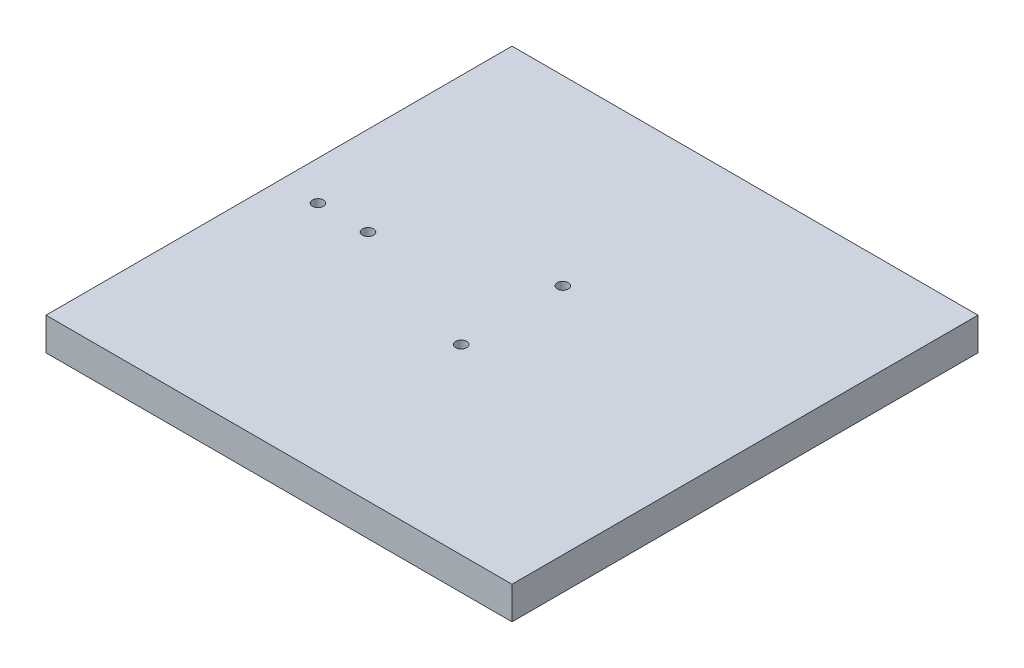
ISO-10303-21;
HEADER;
FILE_DESCRIPTION(('STEP AP214'),'2;1');
FILE_NAME('part.step','',(''),(''),'','','');
FILE_SCHEMA(('AUTOMOTIVE_DESIGN { 1 0 10303 214 1 1 1 1 }'));
ENDSEC;
DATA;
#1=APPLICATION_CONTEXT('core data for automotive mechanical design processes');
#2=APPLICATION_PROTOCOL_DEFINITION('international standard','automotive_design',2000,#1);
#3=PRODUCT_CONTEXT('',#1,'mechanical');
#4=PRODUCT('Part','Part','',(#3));
#5=PRODUCT_RELATED_PRODUCT_CATEGORY('part','',(#4));
#6=PRODUCT_DEFINITION_FORMATION('','',#4);
#7=PRODUCT_DEFINITION_CONTEXT('part definition',#1,'design');
#8=PRODUCT_DEFINITION('design','',#6,#7);
#9=PRODUCT_DEFINITION_SHAPE('','',#8);
#10=(LENGTH_UNIT() NAMED_UNIT(*) SI_UNIT(.MILLI.,.METRE.));
#11=(NAMED_UNIT(*) PLANE_ANGLE_UNIT() SI_UNIT($,.RADIAN.));
#12=(NAMED_UNIT(*) SI_UNIT($,.STERADIAN.) SOLID_ANGLE_UNIT());
#13=UNCERTAINTY_MEASURE_WITH_UNIT(LENGTH_MEASURE(1.E-05),#10,'distance_accuracy_value','');
#14=(GEOMETRIC_REPRESENTATION_CONTEXT(3) GLOBAL_UNCERTAINTY_ASSIGNED_CONTEXT((#13)) GLOBAL_UNIT_ASSIGNED_CONTEXT((#10,
#11,#12)) REPRESENTATION_CONTEXT('',''));
#15=CARTESIAN_POINT('',(0.,0.,0.));
#16=DIRECTION('',(0.,0.,1.));
#17=DIRECTION('',(1.,0.,0.));
#18=AXIS2_PLACEMENT_3D('',#15,#16,#17);
#19=CARTESIAN_POINT('',(0.,0.,139.7));
#20=DIRECTION('',(1.,0.,0.));
#21=DIRECTION('',(0.,0.,-1.));
#22=AXIS2_PLACEMENT_3D('',#19,#20,#21);
#23=PLANE('',#22);
#24=DIRECTION('',(0.,-1.,0.));
#25=VECTOR('',#24,1.);
#26=CARTESIAN_POINT('',(0.,0.,0.));
#27=LINE('',#26,#25);
#28=CARTESIAN_POINT('',(0.,9.779,0.));
#29=VERTEX_POINT('',#28);
#30=CARTESIAN_POINT('',(0.,0.,0.));
#31=VERTEX_POINT('',#30);
#32=EDGE_CURVE('E110',#29,#31,#27,.T.);
#33=ORIENTED_EDGE('',*,*,#32,.T.);
#34=DIRECTION('',(0.,0.,-1.));
#35=VECTOR('',#34,1.);
#36=CARTESIAN_POINT('',(0.,0.,139.7));
#37=LINE('',#36,#35);
#38=CARTESIAN_POINT('',(0.,0.,139.7));
#39=VERTEX_POINT('',#38);
#40=EDGE_CURVE('E12',#39,#31,#37,.T.);
#41=ORIENTED_EDGE('',*,*,#40,.F.);
#42=DIRECTION('',(0.,-1.,0.));
#43=VECTOR('',#42,1.);
#44=CARTESIAN_POINT('',(0.,0.,139.7));
#45=LINE('',#44,#43);
#46=CARTESIAN_POINT('',(0.,9.779,139.7));
#47=VERTEX_POINT('',#46);
#48=EDGE_CURVE('E98',#47,#39,#45,.T.);
#49=ORIENTED_EDGE('',*,*,#48,.F.);
#50=DIRECTION('',(0.,0.,-1.));
#51=VECTOR('',#50,1.);
#52=CARTESIAN_POINT('',(0.,9.779,139.7));
#53=LINE('',#52,#51);
#54=EDGE_CURVE('E106',#47,#29,#53,.T.);
#55=ORIENTED_EDGE('',*,*,#54,.T.);
#56=EDGE_LOOP('',(#33,#41,#49,#55));
#57=FACE_BOUND('',#56,.T.);
#58=ADVANCED_FACE('F47',(#57),#23,.F.);
#59=CARTESIAN_POINT('',(0.,0.,139.7));
#60=DIRECTION('',(0.,1.,0.));
#61=DIRECTION('',(0.,0.,1.));
#62=AXIS2_PLACEMENT_3D('',#59,#60,#61);
#63=PLANE('',#62);
#64=CARTESIAN_POINT('',(69.85,0.,54.61));
#65=DIRECTION('',(0.,1.,0.));
#66=DIRECTION('',(0.,0.,1.));
#67=AXIS2_PLACEMENT_3D('',#64,#65,#66);
#68=CIRCLE('',#67,1.65);
#69=CARTESIAN_POINT('',(69.85,0.,56.26));
#70=VERTEX_POINT('',#69);
#71=EDGE_CURVE('E128',#70,#70,#68,.T.);
#72=ORIENTED_EDGE('',*,*,#71,.T.);
#73=EDGE_LOOP('',(#72));
#74=FACE_BOUND('',#73,.T.);
#75=CARTESIAN_POINT('',(69.85,0.,85.09));
#76=DIRECTION('',(0.,1.,0.));
#77=DIRECTION('',(0.,0.,1.));
#78=AXIS2_PLACEMENT_3D('',#75,#76,#77);
#79=CIRCLE('',#78,1.65);
#80=CARTESIAN_POINT('',(69.85,0.,86.74));
#81=VERTEX_POINT('',#80);
#82=EDGE_CURVE('E139',#81,#81,#79,.T.);
#83=ORIENTED_EDGE('',*,*,#82,.T.);
#84=EDGE_LOOP('',(#83));
#85=FACE_BOUND('',#84,.T.);
#86=CARTESIAN_POINT('',(26.684,0.,69.85));
#87=DIRECTION('',(0.,1.,0.));
#88=DIRECTION('',(0.,0.,1.));
#89=AXIS2_PLACEMENT_3D('',#86,#87,#88);
#90=CIRCLE('',#89,1.65);
#91=CARTESIAN_POINT('',(26.684,0.,71.5));
#92=VERTEX_POINT('',#91);
#93=EDGE_CURVE('E113',#92,#92,#90,.T.);
#94=ORIENTED_EDGE('',*,*,#93,.T.);
#95=EDGE_LOOP('',(#94));
#96=FACE_BOUND('',#95,.T.);
#97=CARTESIAN_POINT('',(11.684,0.,69.85));
#98=DIRECTION('',(0.,1.,0.));
#99=DIRECTION('',(0.,0.,1.));
#100=AXIS2_PLACEMENT_3D('',#97,#98,#99);
#101=CIRCLE('',#100,1.65);
#102=CARTESIAN_POINT('',(11.684,0.,71.5));
#103=VERTEX_POINT('',#102);
#104=EDGE_CURVE('E124',#103,#103,#101,.T.);
#105=ORIENTED_EDGE('',*,*,#104,.T.);
#106=EDGE_LOOP('',(#105));
#107=FACE_BOUND('',#106,.T.);
#108=DIRECTION('',(1.,0.,0.));
#109=VECTOR('',#108,1.);
#110=CARTESIAN_POINT('',(0.,0.,0.));
#111=LINE('',#110,#109);
#112=CARTESIAN_POINT('',(139.7,0.,0.));
#113=VERTEX_POINT('',#112);
#114=EDGE_CURVE('E102',#31,#113,#111,.T.);
#115=ORIENTED_EDGE('',*,*,#114,.T.);
#116=DIRECTION('',(0.,0.,-1.));
#117=VECTOR('',#116,1.);
#118=CARTESIAN_POINT('',(139.7,0.,139.7));
#119=LINE('',#118,#117);
#120=CARTESIAN_POINT('',(139.7,0.,139.7));
#121=VERTEX_POINT('',#120);
#122=EDGE_CURVE('E55',#121,#113,#119,.T.);
#123=ORIENTED_EDGE('',*,*,#122,.F.);
#124=DIRECTION('',(1.,0.,0.));
#125=VECTOR('',#124,1.);
#126=CARTESIAN_POINT('',(0.,0.,139.7));
#127=LINE('',#126,#125);
#128=EDGE_CURVE('E93',#39,#121,#127,.T.);
#129=ORIENTED_EDGE('',*,*,#128,.F.);
#130=ORIENTED_EDGE('',*,*,#40,.T.);
#131=EDGE_LOOP('',(#115,#123,#129,#130));
#132=FACE_BOUND('',#131,.T.);
#133=ADVANCED_FACE('F101',(#74,#85,#96,#107,#132),#63,.F.);
#134=CARTESIAN_POINT('',(139.7,0.,139.7));
#135=DIRECTION('',(-1.,0.,0.));
#136=DIRECTION('',(0.,0.,1.));
#137=AXIS2_PLACEMENT_3D('',#134,#135,#136);
#138=PLANE('',#137);
#139=DIRECTION('',(0.,1.,0.));
#140=VECTOR('',#139,1.);
#141=CARTESIAN_POINT('',(139.7,0.,0.));
#142=LINE('',#141,#140);
#143=CARTESIAN_POINT('',(139.7,9.779,0.));
#144=VERTEX_POINT('',#143);
#145=EDGE_CURVE('E80',#113,#144,#142,.T.);
#146=ORIENTED_EDGE('',*,*,#145,.T.);
#147=DIRECTION('',(0.,0.,-1.));
#148=VECTOR('',#147,1.);
#149=CARTESIAN_POINT('',(139.7,9.779,139.7));
#150=LINE('',#149,#148);
#151=CARTESIAN_POINT('',(139.7,9.779,139.7));
#152=VERTEX_POINT('',#151);
#153=EDGE_CURVE('E103',#152,#144,#150,.T.);
#154=ORIENTED_EDGE('',*,*,#153,.F.);
#155=DIRECTION('',(0.,1.,0.));
#156=VECTOR('',#155,1.);
#157=CARTESIAN_POINT('',(139.7,0.,139.7));
#158=LINE('',#157,#156);
#159=EDGE_CURVE('E96',#121,#152,#158,.T.);
#160=ORIENTED_EDGE('',*,*,#159,.F.);
#161=ORIENTED_EDGE('',*,*,#122,.T.);
#162=EDGE_LOOP('',(#146,#154,#160,#161));
#163=FACE_BOUND('',#162,.T.);
#164=ADVANCED_FACE('F104',(#163),#138,.F.);
#165=CARTESIAN_POINT('',(0.,9.779,139.7));
#166=DIRECTION('',(0.,-1.,0.));
#167=DIRECTION('',(0.,0.,-1.));
#168=AXIS2_PLACEMENT_3D('',#165,#166,#167);
#169=PLANE('',#168);
#170=CARTESIAN_POINT('',(69.85,9.779,54.61));
#171=DIRECTION('',(0.,1.,0.));
#172=DIRECTION('',(0.,0.,1.));
#173=AXIS2_PLACEMENT_3D('',#170,#171,#172);
#174=CIRCLE('',#173,1.65);
#175=CARTESIAN_POINT('',(69.85,9.779,56.26));
#176=VERTEX_POINT('',#175);
#177=EDGE_CURVE('E142',#176,#176,#174,.T.);
#178=ORIENTED_EDGE('',*,*,#177,.F.);
#179=EDGE_LOOP('',(#178));
#180=FACE_BOUND('',#179,.T.);
#181=CARTESIAN_POINT('',(69.85,9.779,85.09));
#182=DIRECTION('',(0.,1.,0.));
#183=DIRECTION('',(0.,0.,1.));
#184=AXIS2_PLACEMENT_3D('',#181,#182,#183);
#185=CIRCLE('',#184,1.65);
#186=CARTESIAN_POINT('',(69.85,9.779,86.74));
#187=VERTEX_POINT('',#186);
#188=EDGE_CURVE('E136',#187,#187,#185,.T.);
#189=ORIENTED_EDGE('',*,*,#188,.F.);
#190=EDGE_LOOP('',(#189));
#191=FACE_BOUND('',#190,.T.);
#192=CARTESIAN_POINT('',(26.684,9.779,69.85));
#193=DIRECTION('',(0.,1.,0.));
#194=DIRECTION('',(0.,0.,1.));
#195=AXIS2_PLACEMENT_3D('',#192,#193,#194);
#196=CIRCLE('',#195,1.65);
#197=CARTESIAN_POINT('',(26.684,9.779,71.5));
#198=VERTEX_POINT('',#197);
#199=EDGE_CURVE('E131',#198,#198,#196,.T.);
#200=ORIENTED_EDGE('',*,*,#199,.F.);
#201=EDGE_LOOP('',(#200));
#202=FACE_BOUND('',#201,.T.);
#203=CARTESIAN_POINT('',(11.684,9.779,69.85));
#204=DIRECTION('',(0.,1.,0.));
#205=DIRECTION('',(0.,0.,1.));
#206=AXIS2_PLACEMENT_3D('',#203,#204,#205);
#207=CIRCLE('',#206,1.65);
#208=CARTESIAN_POINT('',(11.684,9.779,71.5));
#209=VERTEX_POINT('',#208);
#210=EDGE_CURVE('E127',#209,#209,#207,.T.);
#211=ORIENTED_EDGE('',*,*,#210,.F.);
#212=EDGE_LOOP('',(#211));
#213=FACE_BOUND('',#212,.T.);
#214=DIRECTION('',(-1.,0.,0.));
#215=VECTOR('',#214,1.);
#216=CARTESIAN_POINT('',(0.,9.779,0.));
#217=LINE('',#216,#215);
#218=EDGE_CURVE('E86',#144,#29,#217,.T.);
#219=ORIENTED_EDGE('',*,*,#218,.T.);
#220=ORIENTED_EDGE('',*,*,#54,.F.);
#221=DIRECTION('',(-1.,0.,0.));
#222=VECTOR('',#221,1.);
#223=CARTESIAN_POINT('',(0.,9.779,139.7));
#224=LINE('',#223,#222);
#225=EDGE_CURVE('E63',#152,#47,#224,.T.);
#226=ORIENTED_EDGE('',*,*,#225,.F.);
#227=ORIENTED_EDGE('',*,*,#153,.T.);
#228=EDGE_LOOP('',(#219,#220,#226,#227));
#229=FACE_BOUND('',#228,.T.);
#230=ADVANCED_FACE('F118',(#180,#191,#202,#213,#229),#169,.F.);
#231=CARTESIAN_POINT('',(0.,0.,139.7));
#232=DIRECTION('',(0.,0.,-1.));
#233=DIRECTION('',(-1.,0.,0.));
#234=AXIS2_PLACEMENT_3D('',#231,#232,#233);
#235=PLANE('',#234);
#236=ORIENTED_EDGE('',*,*,#48,.T.);
#237=ORIENTED_EDGE('',*,*,#128,.T.);
#238=ORIENTED_EDGE('',*,*,#159,.T.);
#239=ORIENTED_EDGE('',*,*,#225,.T.);
#240=EDGE_LOOP('',(#236,#237,#238,#239));
#241=FACE_BOUND('',#240,.T.);
#242=ADVANCED_FACE('F94',(#241),#235,.F.);
#243=CARTESIAN_POINT('',(0.,0.,0.));
#244=DIRECTION('',(0.,0.,-1.));
#245=DIRECTION('',(-1.,0.,0.));
#246=AXIS2_PLACEMENT_3D('',#243,#244,#245);
#247=PLANE('',#246);
#248=ORIENTED_EDGE('',*,*,#32,.F.);
#249=ORIENTED_EDGE('',*,*,#218,.F.);
#250=ORIENTED_EDGE('',*,*,#145,.F.);
#251=ORIENTED_EDGE('',*,*,#114,.F.);
#252=EDGE_LOOP('',(#248,#249,#250,#251));
#253=FACE_BOUND('',#252,.T.);
#254=ADVANCED_FACE('F121',(#253),#247,.T.);
#255=CARTESIAN_POINT('',(11.684,0.,69.85));
#256=DIRECTION('',(0.,1.,0.));
#257=DIRECTION('',(0.,0.,1.));
#258=AXIS2_PLACEMENT_3D('',#255,#256,#257);
#259=CYLINDRICAL_SURFACE('',#258,1.65);
#260=ORIENTED_EDGE('',*,*,#210,.T.);
#261=EDGE_LOOP('',(#260));
#262=FACE_BOUND('',#261,.T.);
#263=ORIENTED_EDGE('',*,*,#104,.F.);
#264=EDGE_LOOP('',(#263));
#265=FACE_BOUND('',#264,.T.);
#266=ADVANCED_FACE('F166',(#262,#265),#259,.F.);
#267=CARTESIAN_POINT('',(26.684,0.,69.85));
#268=DIRECTION('',(0.,1.,0.));
#269=DIRECTION('',(0.,0.,1.));
#270=AXIS2_PLACEMENT_3D('',#267,#268,#269);
#271=CYLINDRICAL_SURFACE('',#270,1.65);
#272=ORIENTED_EDGE('',*,*,#93,.F.);
#273=EDGE_LOOP('',(#272));
#274=FACE_BOUND('',#273,.T.);
#275=ORIENTED_EDGE('',*,*,#199,.T.);
#276=EDGE_LOOP('',(#275));
#277=FACE_BOUND('',#276,.T.);
#278=ADVANCED_FACE('F169',(#274,#277),#271,.F.);
#279=CARTESIAN_POINT('',(69.85,0.,85.09));
#280=DIRECTION('',(0.,1.,0.));
#281=DIRECTION('',(0.,0.,1.));
#282=AXIS2_PLACEMENT_3D('',#279,#280,#281);
#283=CYLINDRICAL_SURFACE('',#282,1.65);
#284=ORIENTED_EDGE('',*,*,#82,.F.);
#285=EDGE_LOOP('',(#284));
#286=FACE_BOUND('',#285,.T.);
#287=ORIENTED_EDGE('',*,*,#188,.T.);
#288=EDGE_LOOP('',(#287));
#289=FACE_BOUND('',#288,.T.);
#290=ADVANCED_FACE('F153',(#286,#289),#283,.F.);
#291=CARTESIAN_POINT('',(69.85,0.,54.61));
#292=DIRECTION('',(0.,1.,0.));
#293=DIRECTION('',(0.,0.,1.));
#294=AXIS2_PLACEMENT_3D('',#291,#292,#293);
#295=CYLINDRICAL_SURFACE('',#294,1.65);
#296=ORIENTED_EDGE('',*,*,#71,.F.);
#297=EDGE_LOOP('',(#296));
#298=FACE_BOUND('',#297,.T.);
#299=ORIENTED_EDGE('',*,*,#177,.T.);
#300=EDGE_LOOP('',(#299));
#301=FACE_BOUND('',#300,.T.);
#302=ADVANCED_FACE('F150',(#298,#301),#295,.F.);
#303=CLOSED_SHELL('',(#58,#133,#164,#230,#242,#254,#266,#278,#290,#302));
#304=MANIFOLD_SOLID_BREP('B2',#303);
#305=ADVANCED_BREP_SHAPE_REPRESENTATION('',(#18,#304),#14);
#306=SHAPE_DEFINITION_REPRESENTATION(#9,#305);
ENDSEC;
END-ISO-10303-21;
